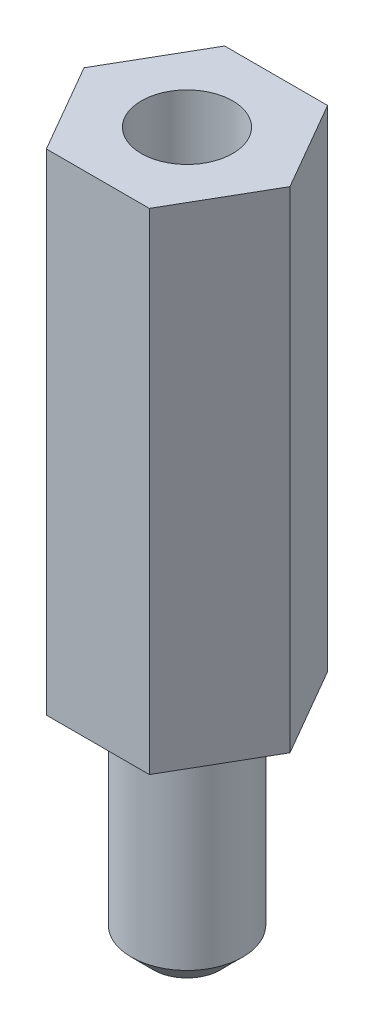
ISO-10303-21;
HEADER;
FILE_DESCRIPTION(('STEP AP214'),'2;1');
FILE_NAME('part.step','',(''),(''),'','','');
FILE_SCHEMA(('AUTOMOTIVE_DESIGN { 1 0 10303 214 1 1 1 1 }'));
ENDSEC;
DATA;
#1=APPLICATION_CONTEXT('core data for automotive mechanical design processes');
#2=APPLICATION_PROTOCOL_DEFINITION('international standard','automotive_design',2000,#1);
#3=PRODUCT_CONTEXT('',#1,'mechanical');
#4=PRODUCT('Part','Part','',(#3));
#5=PRODUCT_RELATED_PRODUCT_CATEGORY('part','',(#4));
#6=PRODUCT_DEFINITION_FORMATION('','',#4);
#7=PRODUCT_DEFINITION_CONTEXT('part definition',#1,'design');
#8=PRODUCT_DEFINITION('design','',#6,#7);
#9=PRODUCT_DEFINITION_SHAPE('','',#8);
#10=(LENGTH_UNIT() NAMED_UNIT(*) SI_UNIT(.MILLI.,.METRE.));
#11=(NAMED_UNIT(*) PLANE_ANGLE_UNIT() SI_UNIT($,.RADIAN.));
#12=(NAMED_UNIT(*) SI_UNIT($,.STERADIAN.) SOLID_ANGLE_UNIT());
#13=UNCERTAINTY_MEASURE_WITH_UNIT(LENGTH_MEASURE(1.E-05),#10,'distance_accuracy_value','');
#14=(GEOMETRIC_REPRESENTATION_CONTEXT(3) GLOBAL_UNCERTAINTY_ASSIGNED_CONTEXT((#13)) GLOBAL_UNIT_ASSIGNED_CONTEXT((#10,
#11,#12)) REPRESENTATION_CONTEXT('',''));
#15=CARTESIAN_POINT('',(0.,0.,0.));
#16=DIRECTION('',(0.,0.,1.));
#17=DIRECTION('',(1.,0.,0.));
#18=AXIS2_PLACEMENT_3D('',#15,#16,#17);
#19=CARTESIAN_POINT('',(-1.7320508075689,11.,0.999999999999945));
#20=DIRECTION('',(0.866025403784438,0.,-0.5));
#21=DIRECTION('',(-0.5,0.,-0.866025403784438));
#22=AXIS2_PLACEMENT_3D('',#19,#20,#21);
#23=PLANE('',#22);
#24=DIRECTION('',(0.5,0.,0.86602540378444));
#25=VECTOR('',#24,1.);
#26=CARTESIAN_POINT('',(-1.7320508075689,0.,0.999999999999945));
#27=LINE('',#26,#25);
#28=CARTESIAN_POINT('',(-2.30940107675838,0.,-1.2490009027033E-13));
#29=VERTEX_POINT('',#28);
#30=CARTESIAN_POINT('',(-1.15470053837916,0.,1.99999999999989));
#31=VERTEX_POINT('',#30);
#32=EDGE_CURVE('E124',#29,#31,#27,.T.);
#33=ORIENTED_EDGE('',*,*,#32,.T.);
#34=DIRECTION('',(0.,-1.,0.));
#35=VECTOR('',#34,1.);
#36=CARTESIAN_POINT('',(-1.15470053837916,11.,1.99999999999989));
#37=LINE('',#36,#35);
#38=CARTESIAN_POINT('',(-1.15470053837916,11.,1.99999999999989));
#39=VERTEX_POINT('',#38);
#40=EDGE_CURVE('E142',#39,#31,#37,.T.);
#41=ORIENTED_EDGE('',*,*,#40,.F.);
#42=DIRECTION('',(0.5,0.,0.86602540378444));
#43=VECTOR('',#42,1.);
#44=CARTESIAN_POINT('',(-1.7320508075689,11.,0.999999999999945));
#45=LINE('',#44,#43);
#46=CARTESIAN_POINT('',(-2.30940107675838,11.,-1.2490009027033E-13));
#47=VERTEX_POINT('',#46);
#48=EDGE_CURVE('E135',#47,#39,#45,.T.);
#49=ORIENTED_EDGE('',*,*,#48,.F.);
#50=DIRECTION('',(0.,-1.,0.));
#51=VECTOR('',#50,1.);
#52=CARTESIAN_POINT('',(-2.30940107675838,11.,-1.2490009027033E-13));
#53=LINE('',#52,#51);
#54=EDGE_CURVE('E120',#47,#29,#53,.T.);
#55=ORIENTED_EDGE('',*,*,#54,.T.);
#56=EDGE_LOOP('',(#33,#41,#49,#55));
#57=FACE_BOUND('',#56,.T.);
#58=ADVANCED_FACE('F36',(#57),#23,.F.);
#59=CARTESIAN_POINT('',(0.,11.,1.99999999999999));
#60=DIRECTION('',(0.,0.,-1.));
#61=DIRECTION('',(-1.,0.,0.));
#62=AXIS2_PLACEMENT_3D('',#59,#60,#61);
#63=PLANE('',#62);
#64=DIRECTION('',(1.,0.,0.));
#65=VECTOR('',#64,1.);
#66=CARTESIAN_POINT('',(0.,0.,1.99999999999999));
#67=LINE('',#66,#65);
#68=CARTESIAN_POINT('',(1.15470053837931,0.,1.99999999999998));
#69=VERTEX_POINT('',#68);
#70=EDGE_CURVE('E127',#31,#69,#67,.T.);
#71=ORIENTED_EDGE('',*,*,#70,.T.);
#72=DIRECTION('',(0.,-1.,0.));
#73=VECTOR('',#72,1.);
#74=CARTESIAN_POINT('',(1.15470053837931,11.,1.99999999999998));
#75=LINE('',#74,#73);
#76=CARTESIAN_POINT('',(1.15470053837931,11.,1.99999999999998));
#77=VERTEX_POINT('',#76);
#78=EDGE_CURVE('E139',#77,#69,#75,.T.);
#79=ORIENTED_EDGE('',*,*,#78,.F.);
#80=DIRECTION('',(1.,0.,0.));
#81=VECTOR('',#80,1.);
#82=CARTESIAN_POINT('',(0.,11.,1.99999999999999));
#83=LINE('',#82,#81);
#84=EDGE_CURVE('E92',#39,#77,#83,.T.);
#85=ORIENTED_EDGE('',*,*,#84,.F.);
#86=ORIENTED_EDGE('',*,*,#40,.T.);
#87=EDGE_LOOP('',(#71,#79,#85,#86));
#88=FACE_BOUND('',#87,.T.);
#89=ADVANCED_FACE('F164',(#88),#63,.F.);
#90=CARTESIAN_POINT('',(1.73205080756901,11.,0.999999999999945));
#91=DIRECTION('',(-0.86602540378444,0.,-0.500000000000001));
#92=DIRECTION('',(-0.5,0.,0.866025403784439));
#93=AXIS2_PLACEMENT_3D('',#90,#91,#92);
#94=PLANE('',#93);
#95=DIRECTION('',(0.500000000000001,0.,-0.86602540378444));
#96=VECTOR('',#95,1.);
#97=CARTESIAN_POINT('',(1.73205080756901,0.,0.999999999999945));
#98=LINE('',#97,#96);
#99=CARTESIAN_POINT('',(2.30940107675849,0.,0.));
#100=VERTEX_POINT('',#99);
#101=EDGE_CURVE('E130',#69,#100,#98,.T.);
#102=ORIENTED_EDGE('',*,*,#101,.T.);
#103=DIRECTION('',(0.,-1.,0.));
#104=VECTOR('',#103,1.);
#105=CARTESIAN_POINT('',(2.30940107675849,11.,0.));
#106=LINE('',#105,#104);
#107=CARTESIAN_POINT('',(2.30940107675849,11.,0.));
#108=VERTEX_POINT('',#107);
#109=EDGE_CURVE('E115',#108,#100,#106,.T.);
#110=ORIENTED_EDGE('',*,*,#109,.F.);
#111=DIRECTION('',(0.500000000000001,0.,-0.86602540378444));
#112=VECTOR('',#111,1.);
#113=CARTESIAN_POINT('',(1.73205080756901,11.,0.999999999999945));
#114=LINE('',#113,#112);
#115=EDGE_CURVE('E106',#77,#108,#114,.T.);
#116=ORIENTED_EDGE('',*,*,#115,.F.);
#117=ORIENTED_EDGE('',*,*,#78,.T.);
#118=EDGE_LOOP('',(#102,#110,#116,#117));
#119=FACE_BOUND('',#118,.T.);
#120=ADVANCED_FACE('F169',(#119),#94,.F.);
#121=CARTESIAN_POINT('',(1.73205080756895,11.,-0.999999999999987));
#122=DIRECTION('',(-0.866025403784439,0.,0.5));
#123=DIRECTION('',(0.5,0.,0.866025403784439));
#124=AXIS2_PLACEMENT_3D('',#121,#122,#123);
#125=PLANE('',#124);
#126=DIRECTION('',(-0.500000000000001,0.,-0.866025403784439));
#127=VECTOR('',#126,1.);
#128=CARTESIAN_POINT('',(1.73205080756895,0.,-0.999999999999987));
#129=LINE('',#128,#127);
#130=CARTESIAN_POINT('',(1.15470053837931,0.,-2.00000000000011));
#131=VERTEX_POINT('',#130);
#132=EDGE_CURVE('E114',#100,#131,#129,.T.);
#133=ORIENTED_EDGE('',*,*,#132,.T.);
#134=DIRECTION('',(0.,-1.,0.));
#135=VECTOR('',#134,1.);
#136=CARTESIAN_POINT('',(1.15470053837931,11.,-2.00000000000011));
#137=LINE('',#136,#135);
#138=CARTESIAN_POINT('',(1.15470053837931,11.,-2.00000000000011));
#139=VERTEX_POINT('',#138);
#140=EDGE_CURVE('E111',#139,#131,#137,.T.);
#141=ORIENTED_EDGE('',*,*,#140,.F.);
#142=DIRECTION('',(-0.500000000000001,0.,-0.866025403784439));
#143=VECTOR('',#142,1.);
#144=CARTESIAN_POINT('',(1.73205080756895,11.,-0.999999999999987));
#145=LINE('',#144,#143);
#146=EDGE_CURVE('E100',#108,#139,#145,.T.);
#147=ORIENTED_EDGE('',*,*,#146,.F.);
#148=ORIENTED_EDGE('',*,*,#109,.T.);
#149=EDGE_LOOP('',(#133,#141,#147,#148));
#150=FACE_BOUND('',#149,.T.);
#151=ADVANCED_FACE('F112',(#150),#125,.F.);
#152=CARTESIAN_POINT('',(1.52655665885959E-13,11.,-2.00000000000011));
#153=DIRECTION('',(0.,0.,1.));
#154=DIRECTION('',(1.,0.,0.));
#155=AXIS2_PLACEMENT_3D('',#152,#153,#154);
#156=PLANE('',#155);
#157=DIRECTION('',(-1.,0.,0.));
#158=VECTOR('',#157,1.);
#159=CARTESIAN_POINT('',(1.52655665885959E-13,0.,-2.00000000000011));
#160=LINE('',#159,#158);
#161=CARTESIAN_POINT('',(-1.1547005383792,0.,-1.99999999999999));
#162=VERTEX_POINT('',#161);
#163=EDGE_CURVE('E77',#131,#162,#160,.T.);
#164=ORIENTED_EDGE('',*,*,#163,.T.);
#165=DIRECTION('',(0.,-1.,0.));
#166=VECTOR('',#165,1.);
#167=CARTESIAN_POINT('',(-1.1547005383792,11.,-1.99999999999999));
#168=LINE('',#167,#166);
#169=CARTESIAN_POINT('',(-1.1547005383792,11.,-1.99999999999999));
#170=VERTEX_POINT('',#169);
#171=EDGE_CURVE('E116',#170,#162,#168,.T.);
#172=ORIENTED_EDGE('',*,*,#171,.F.);
#173=DIRECTION('',(-1.,0.,0.));
#174=VECTOR('',#173,1.);
#175=CARTESIAN_POINT('',(1.52655665885959E-13,11.,-2.00000000000011));
#176=LINE('',#175,#174);
#177=EDGE_CURVE('E104',#139,#170,#176,.T.);
#178=ORIENTED_EDGE('',*,*,#177,.F.);
#179=ORIENTED_EDGE('',*,*,#140,.T.);
#180=EDGE_LOOP('',(#164,#172,#178,#179));
#181=FACE_BOUND('',#180,.T.);
#182=ADVANCED_FACE('F118',(#181),#156,.F.);
#183=CARTESIAN_POINT('',(-1.73205080756873,11.,-1.00000000000013));
#184=DIRECTION('',(0.866025403784439,0.,0.5));
#185=DIRECTION('',(0.5,0.,-0.866025403784439));
#186=AXIS2_PLACEMENT_3D('',#183,#184,#185);
#187=PLANE('',#186);
#188=DIRECTION('',(-0.5,0.,0.866025403784439));
#189=VECTOR('',#188,1.);
#190=CARTESIAN_POINT('',(-1.73205080756873,0.,-1.00000000000013));
#191=LINE('',#190,#189);
#192=EDGE_CURVE('E83',#162,#29,#191,.T.);
#193=ORIENTED_EDGE('',*,*,#192,.T.);
#194=ORIENTED_EDGE('',*,*,#54,.F.);
#195=DIRECTION('',(-0.5,0.,0.866025403784439));
#196=VECTOR('',#195,1.);
#197=CARTESIAN_POINT('',(-1.73205080756873,11.,-1.00000000000013));
#198=LINE('',#197,#196);
#199=EDGE_CURVE('E53',#170,#47,#198,.T.);
#200=ORIENTED_EDGE('',*,*,#199,.F.);
#201=ORIENTED_EDGE('',*,*,#171,.T.);
#202=EDGE_LOOP('',(#193,#194,#200,#201));
#203=FACE_BOUND('',#202,.T.);
#204=ADVANCED_FACE('F179',(#203),#187,.F.);
#205=CARTESIAN_POINT('',(0.,11.,0.));
#206=DIRECTION('',(0.,1.,0.));
#207=DIRECTION('',(0.,0.,1.));
#208=AXIS2_PLACEMENT_3D('',#205,#206,#207);
#209=PLANE('',#208);
#210=CARTESIAN_POINT('',(0.,11.,0.));
#211=DIRECTION('',(0.,1.,0.));
#212=DIRECTION('',(0.,0.,1.));
#213=AXIS2_PLACEMENT_3D('',#210,#211,#212);
#214=CIRCLE('',#213,1.02499999999999);
#215=CARTESIAN_POINT('',(0.,11.,1.02499999999999));
#216=VERTEX_POINT('',#215);
#217=EDGE_CURVE('E201',#216,#216,#214,.T.);
#218=ORIENTED_EDGE('',*,*,#217,.F.);
#219=EDGE_LOOP('',(#218));
#220=FACE_BOUND('',#219,.T.);
#221=ORIENTED_EDGE('',*,*,#48,.T.);
#222=ORIENTED_EDGE('',*,*,#84,.T.);
#223=ORIENTED_EDGE('',*,*,#115,.T.);
#224=ORIENTED_EDGE('',*,*,#146,.T.);
#225=ORIENTED_EDGE('',*,*,#177,.T.);
#226=ORIENTED_EDGE('',*,*,#199,.T.);
#227=EDGE_LOOP('',(#221,#222,#223,#224,#225,#226));
#228=FACE_BOUND('',#227,.T.);
#229=ADVANCED_FACE('F102',(#220,#228),#209,.T.);
#230=CARTESIAN_POINT('',(0.,0.,0.));
#231=DIRECTION('',(0.,1.,0.));
#232=DIRECTION('',(0.,0.,1.));
#233=AXIS2_PLACEMENT_3D('',#230,#231,#232);
#234=PLANE('',#233);
#235=CARTESIAN_POINT('',(0.,0.,0.));
#236=DIRECTION('',(0.,1.,0.));
#237=DIRECTION('',(0.,0.,1.));
#238=AXIS2_PLACEMENT_3D('',#235,#236,#237);
#239=CIRCLE('',#238,1.25);
#240=CARTESIAN_POINT('',(0.,0.,1.25));
#241=VERTEX_POINT('',#240);
#242=EDGE_CURVE('E128',#241,#241,#239,.T.);
#243=ORIENTED_EDGE('',*,*,#242,.T.);
#244=EDGE_LOOP('',(#243));
#245=FACE_BOUND('',#244,.T.);
#246=ORIENTED_EDGE('',*,*,#32,.F.);
#247=ORIENTED_EDGE('',*,*,#192,.F.);
#248=ORIENTED_EDGE('',*,*,#163,.F.);
#249=ORIENTED_EDGE('',*,*,#132,.F.);
#250=ORIENTED_EDGE('',*,*,#101,.F.);
#251=ORIENTED_EDGE('',*,*,#70,.F.);
#252=EDGE_LOOP('',(#246,#247,#248,#249,#250,#251));
#253=FACE_BOUND('',#252,.T.);
#254=ADVANCED_FACE('F182',(#245,#253),#234,.F.);
#255=CARTESIAN_POINT('',(0.,-5.,0.));
#256=DIRECTION('',(0.,1.,0.));
#257=DIRECTION('',(0.,0.,1.));
#258=AXIS2_PLACEMENT_3D('',#255,#256,#257);
#259=CYLINDRICAL_SURFACE('',#258,1.25);
#260=CARTESIAN_POINT('',(0.,-4.5,0.));
#261=DIRECTION('',(0.,1.,0.));
#262=DIRECTION('',(0.,0.,1.));
#263=AXIS2_PLACEMENT_3D('',#260,#261,#262);
#264=CIRCLE('',#263,1.25);
#265=CARTESIAN_POINT('',(0.,-4.5,1.25));
#266=VERTEX_POINT('',#265);
#267=EDGE_CURVE('E45',#266,#266,#264,.T.);
#268=ORIENTED_EDGE('',*,*,#267,.T.);
#269=EDGE_LOOP('',(#268));
#270=FACE_BOUND('',#269,.T.);
#271=ORIENTED_EDGE('',*,*,#242,.F.);
#272=EDGE_LOOP('',(#271));
#273=FACE_BOUND('',#272,.T.);
#274=ADVANCED_FACE('F146',(#270,#273),#259,.T.);
#275=CARTESIAN_POINT('',(0.,-5.,0.));
#276=DIRECTION('',(0.,1.,0.));
#277=DIRECTION('',(0.,0.,1.));
#278=AXIS2_PLACEMENT_3D('',#275,#276,#277);
#279=PLANE('',#278);
#280=CARTESIAN_POINT('',(0.,-5.,0.));
#281=DIRECTION('',(0.,1.,0.));
#282=DIRECTION('',(0.,0.,1.));
#283=AXIS2_PLACEMENT_3D('',#280,#281,#282);
#284=CIRCLE('',#283,0.749999999999997);
#285=CARTESIAN_POINT('',(0.,-5.,0.749999999999998));
#286=VERTEX_POINT('',#285);
#287=EDGE_CURVE('E11',#286,#286,#284,.F.);
#288=ORIENTED_EDGE('',*,*,#287,.T.);
#289=EDGE_LOOP('',(#288));
#290=FACE_BOUND('',#289,.T.);
#291=ADVANCED_FACE('F151',(#290),#279,.F.);
#292=CARTESIAN_POINT('',(0.,-4.5,0.));
#293=DIRECTION('',(0.,1.,0.));
#294=DIRECTION('',(0.,0.,1.));
#295=AXIS2_PLACEMENT_3D('',#292,#293,#294);
#296=CONICAL_SURFACE('',#295,1.25,0.785398163397449);
#297=ORIENTED_EDGE('',*,*,#287,.F.);
#298=EDGE_LOOP('',(#297));
#299=FACE_BOUND('',#298,.T.);
#300=ORIENTED_EDGE('',*,*,#267,.F.);
#301=EDGE_LOOP('',(#300));
#302=FACE_BOUND('',#301,.T.);
#303=ADVANCED_FACE('F38',(#299,#302),#296,.T.);
#304=CARTESIAN_POINT('',(0.,1.,0.));
#305=DIRECTION('',(0.,1.,0.));
#306=DIRECTION('',(0.,0.,1.));
#307=AXIS2_PLACEMENT_3D('',#304,#305,#306);
#308=CONICAL_SURFACE('',#307,1.025,1.02974425867665);
#309=CARTESIAN_POINT('',(0.,0.384117865496747,0.));
#310=VERTEX_POINT('',#309);
#311=VERTEX_LOOP('',#310);
#312=FACE_BOUND('',#311,.T.);
#313=CARTESIAN_POINT('',(0.,1.,0.));
#314=DIRECTION('',(0.,1.,0.));
#315=DIRECTION('',(0.,0.,1.));
#316=AXIS2_PLACEMENT_3D('',#313,#314,#315);
#317=CIRCLE('',#316,1.025);
#318=CARTESIAN_POINT('',(0.,1.,1.025));
#319=VERTEX_POINT('',#318);
#320=EDGE_CURVE('E198',#319,#319,#317,.T.);
#321=ORIENTED_EDGE('',*,*,#320,.T.);
#322=EDGE_LOOP('',(#321));
#323=FACE_BOUND('',#322,.T.);
#324=ADVANCED_FACE('F150',(#312,#323),#308,.F.);
#325=CARTESIAN_POINT('',(0.,11.,0.));
#326=DIRECTION('',(0.,1.,0.));
#327=DIRECTION('',(0.,0.,1.));
#328=AXIS2_PLACEMENT_3D('',#325,#326,#327);
#329=CYLINDRICAL_SURFACE('',#328,1.02499999999999);
#330=ORIENTED_EDGE('',*,*,#320,.F.);
#331=EDGE_LOOP('',(#330));
#332=FACE_BOUND('',#331,.T.);
#333=ORIENTED_EDGE('',*,*,#217,.T.);
#334=EDGE_LOOP('',(#333));
#335=FACE_BOUND('',#334,.T.);
#336=ADVANCED_FACE('F157',(#332,#335),#329,.F.);
#337=CLOSED_SHELL('',(#58,#89,#120,#151,#182,#204,#229,#254,#274,#291,#303,#324,#336));
#338=MANIFOLD_SOLID_BREP('B2',#337);
#339=ADVANCED_BREP_SHAPE_REPRESENTATION('',(#18,#338),#14);
#340=SHAPE_DEFINITION_REPRESENTATION(#9,#339);
ENDSEC;
END-ISO-10303-21;
